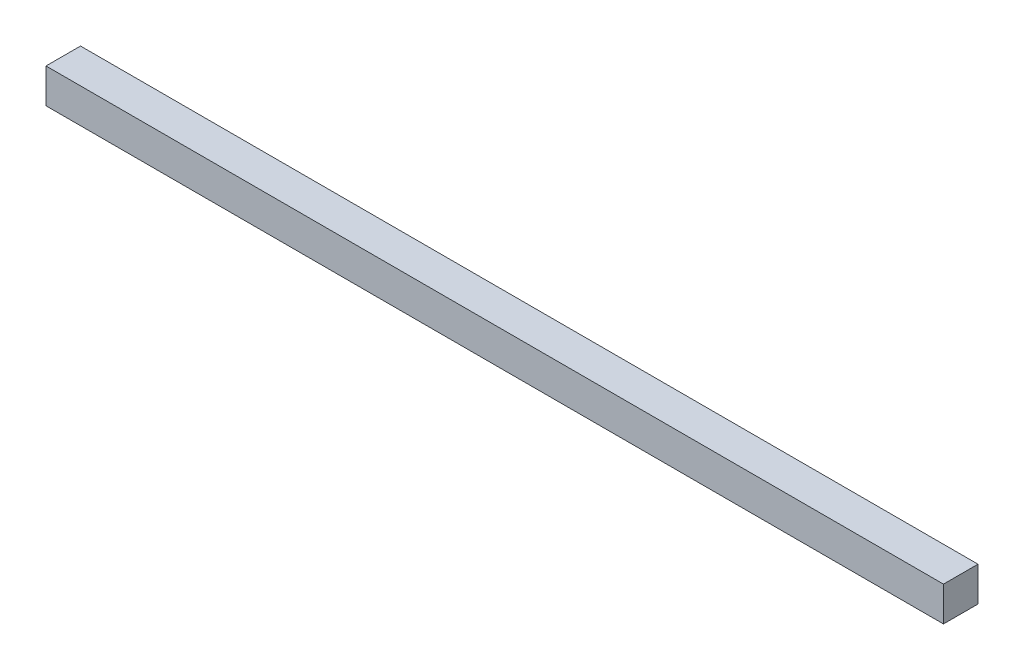
ISO-10303-21;
HEADER;
FILE_DESCRIPTION(('STEP AP214'),'2;1');
FILE_NAME('part.step','',(''),(''),'','','');
FILE_SCHEMA(('AUTOMOTIVE_DESIGN { 1 0 10303 214 1 1 1 1 }'));
ENDSEC;
DATA;
#1=APPLICATION_CONTEXT('core data for automotive mechanical design processes');
#2=APPLICATION_PROTOCOL_DEFINITION('international standard','automotive_design',2000,#1);
#3=PRODUCT_CONTEXT('',#1,'mechanical');
#4=PRODUCT('Part','Part','',(#3));
#5=PRODUCT_RELATED_PRODUCT_CATEGORY('part','',(#4));
#6=PRODUCT_DEFINITION_FORMATION('','',#4);
#7=PRODUCT_DEFINITION_CONTEXT('part definition',#1,'design');
#8=PRODUCT_DEFINITION('design','',#6,#7);
#9=PRODUCT_DEFINITION_SHAPE('','',#8);
#10=(LENGTH_UNIT() NAMED_UNIT(*) SI_UNIT(.MILLI.,.METRE.));
#11=(NAMED_UNIT(*) PLANE_ANGLE_UNIT() SI_UNIT($,.RADIAN.));
#12=(NAMED_UNIT(*) SI_UNIT($,.STERADIAN.) SOLID_ANGLE_UNIT());
#13=UNCERTAINTY_MEASURE_WITH_UNIT(LENGTH_MEASURE(1.E-05),#10,'distance_accuracy_value','');
#14=(GEOMETRIC_REPRESENTATION_CONTEXT(3) GLOBAL_UNCERTAINTY_ASSIGNED_CONTEXT((#13)) GLOBAL_UNIT_ASSIGNED_CONTEXT((#10,
#11,#12)) REPRESENTATION_CONTEXT('',''));
#15=CARTESIAN_POINT('',(0.,0.,0.));
#16=DIRECTION('',(0.,0.,1.));
#17=DIRECTION('',(1.,0.,0.));
#18=AXIS2_PLACEMENT_3D('',#15,#16,#17);
#19=CARTESIAN_POINT('',(0.,38.1,0.));
#20=DIRECTION('',(1.,0.,0.));
#21=DIRECTION('',(0.,0.,-1.));
#22=AXIS2_PLACEMENT_3D('',#19,#20,#21);
#23=PLANE('',#22);
#24=DIRECTION('',(0.,0.,1.));
#25=VECTOR('',#24,1.);
#26=CARTESIAN_POINT('',(0.,0.,0.));
#27=LINE('',#26,#25);
#28=CARTESIAN_POINT('',(0.,0.,-38.1));
#29=VERTEX_POINT('',#28);
#30=CARTESIAN_POINT('',(0.,0.,0.));
#31=VERTEX_POINT('',#30);
#32=EDGE_CURVE('E95',#29,#31,#27,.T.);
#33=ORIENTED_EDGE('',*,*,#32,.T.);
#34=DIRECTION('',(0.,-1.,0.));
#35=VECTOR('',#34,1.);
#36=CARTESIAN_POINT('',(0.,38.1,0.));
#37=LINE('',#36,#35);
#38=CARTESIAN_POINT('',(0.,38.1,0.));
#39=VERTEX_POINT('',#38);
#40=EDGE_CURVE('E11',#39,#31,#37,.T.);
#41=ORIENTED_EDGE('',*,*,#40,.F.);
#42=DIRECTION('',(0.,0.,1.));
#43=VECTOR('',#42,1.);
#44=CARTESIAN_POINT('',(0.,38.1,0.));
#45=LINE('',#44,#43);
#46=CARTESIAN_POINT('',(0.,38.1,-38.1));
#47=VERTEX_POINT('',#46);
#48=EDGE_CURVE('E83',#47,#39,#45,.T.);
#49=ORIENTED_EDGE('',*,*,#48,.F.);
#50=DIRECTION('',(0.,-1.,0.));
#51=VECTOR('',#50,1.);
#52=CARTESIAN_POINT('',(0.,38.1,-38.1));
#53=LINE('',#52,#51);
#54=EDGE_CURVE('E91',#47,#29,#53,.T.);
#55=ORIENTED_EDGE('',*,*,#54,.T.);
#56=EDGE_LOOP('',(#33,#41,#49,#55));
#57=FACE_BOUND('',#56,.T.);
#58=ADVANCED_FACE('F32',(#57),#23,.F.);
#59=CARTESIAN_POINT('',(0.,38.1,0.));
#60=DIRECTION('',(0.,0.,-1.));
#61=DIRECTION('',(-1.,0.,0.));
#62=AXIS2_PLACEMENT_3D('',#59,#60,#61);
#63=PLANE('',#62);
#64=DIRECTION('',(1.,0.,0.));
#65=VECTOR('',#64,1.);
#66=CARTESIAN_POINT('',(0.,0.,0.));
#67=LINE('',#66,#65);
#68=CARTESIAN_POINT('',(990.6,0.,0.));
#69=VERTEX_POINT('',#68);
#70=EDGE_CURVE('E87',#31,#69,#67,.T.);
#71=ORIENTED_EDGE('',*,*,#70,.T.);
#72=DIRECTION('',(0.,-1.,0.));
#73=VECTOR('',#72,1.);
#74=CARTESIAN_POINT('',(990.6,38.1,0.));
#75=LINE('',#74,#73);
#76=CARTESIAN_POINT('',(990.6,38.1,0.));
#77=VERTEX_POINT('',#76);
#78=EDGE_CURVE('E40',#77,#69,#75,.T.);
#79=ORIENTED_EDGE('',*,*,#78,.F.);
#80=DIRECTION('',(1.,0.,0.));
#81=VECTOR('',#80,1.);
#82=CARTESIAN_POINT('',(0.,38.1,0.));
#83=LINE('',#82,#81);
#84=EDGE_CURVE('E78',#39,#77,#83,.T.);
#85=ORIENTED_EDGE('',*,*,#84,.F.);
#86=ORIENTED_EDGE('',*,*,#40,.T.);
#87=EDGE_LOOP('',(#71,#79,#85,#86));
#88=FACE_BOUND('',#87,.T.);
#89=ADVANCED_FACE('F86',(#88),#63,.F.);
#90=CARTESIAN_POINT('',(990.6,38.1,0.));
#91=DIRECTION('',(-1.,0.,0.));
#92=DIRECTION('',(0.,0.,1.));
#93=AXIS2_PLACEMENT_3D('',#90,#91,#92);
#94=PLANE('',#93);
#95=DIRECTION('',(0.,0.,-1.));
#96=VECTOR('',#95,1.);
#97=CARTESIAN_POINT('',(990.6,0.,0.));
#98=LINE('',#97,#96);
#99=CARTESIAN_POINT('',(990.6,0.,-38.1));
#100=VERTEX_POINT('',#99);
#101=EDGE_CURVE('E65',#69,#100,#98,.T.);
#102=ORIENTED_EDGE('',*,*,#101,.T.);
#103=DIRECTION('',(0.,-1.,0.));
#104=VECTOR('',#103,1.);
#105=CARTESIAN_POINT('',(990.6,38.1,-38.1));
#106=LINE('',#105,#104);
#107=CARTESIAN_POINT('',(990.6,38.1,-38.1));
#108=VERTEX_POINT('',#107);
#109=EDGE_CURVE('E88',#108,#100,#106,.T.);
#110=ORIENTED_EDGE('',*,*,#109,.F.);
#111=DIRECTION('',(0.,0.,-1.));
#112=VECTOR('',#111,1.);
#113=CARTESIAN_POINT('',(990.6,38.1,0.));
#114=LINE('',#113,#112);
#115=EDGE_CURVE('E81',#77,#108,#114,.T.);
#116=ORIENTED_EDGE('',*,*,#115,.F.);
#117=ORIENTED_EDGE('',*,*,#78,.T.);
#118=EDGE_LOOP('',(#102,#110,#116,#117));
#119=FACE_BOUND('',#118,.T.);
#120=ADVANCED_FACE('F89',(#119),#94,.F.);
#121=CARTESIAN_POINT('',(0.,38.1,-38.1));
#122=DIRECTION('',(0.,0.,1.));
#123=DIRECTION('',(1.,0.,0.));
#124=AXIS2_PLACEMENT_3D('',#121,#122,#123);
#125=PLANE('',#124);
#126=DIRECTION('',(-1.,0.,0.));
#127=VECTOR('',#126,1.);
#128=CARTESIAN_POINT('',(0.,0.,-38.1));
#129=LINE('',#128,#127);
#130=EDGE_CURVE('E71',#100,#29,#129,.T.);
#131=ORIENTED_EDGE('',*,*,#130,.T.);
#132=ORIENTED_EDGE('',*,*,#54,.F.);
#133=DIRECTION('',(-1.,0.,0.));
#134=VECTOR('',#133,1.);
#135=CARTESIAN_POINT('',(0.,38.1,-38.1));
#136=LINE('',#135,#134);
#137=EDGE_CURVE('E48',#108,#47,#136,.T.);
#138=ORIENTED_EDGE('',*,*,#137,.F.);
#139=ORIENTED_EDGE('',*,*,#109,.T.);
#140=EDGE_LOOP('',(#131,#132,#138,#139));
#141=FACE_BOUND('',#140,.T.);
#142=ADVANCED_FACE('F102',(#141),#125,.F.);
#143=CARTESIAN_POINT('',(0.,38.1,-38.1));
#144=DIRECTION('',(0.,-1.,0.));
#145=DIRECTION('',(0.,0.,-1.));
#146=AXIS2_PLACEMENT_3D('',#143,#144,#145);
#147=PLANE('',#146);
#148=ORIENTED_EDGE('',*,*,#48,.T.);
#149=ORIENTED_EDGE('',*,*,#84,.T.);
#150=ORIENTED_EDGE('',*,*,#115,.T.);
#151=ORIENTED_EDGE('',*,*,#137,.T.);
#152=EDGE_LOOP('',(#148,#149,#150,#151));
#153=FACE_BOUND('',#152,.T.);
#154=ADVANCED_FACE('F79',(#153),#147,.F.);
#155=CARTESIAN_POINT('',(0.,0.,-38.1));
#156=DIRECTION('',(0.,-1.,0.));
#157=DIRECTION('',(0.,0.,-1.));
#158=AXIS2_PLACEMENT_3D('',#155,#156,#157);
#159=PLANE('',#158);
#160=ORIENTED_EDGE('',*,*,#32,.F.);
#161=ORIENTED_EDGE('',*,*,#130,.F.);
#162=ORIENTED_EDGE('',*,*,#101,.F.);
#163=ORIENTED_EDGE('',*,*,#70,.F.);
#164=EDGE_LOOP('',(#160,#161,#162,#163));
#165=FACE_BOUND('',#164,.T.);
#166=ADVANCED_FACE('F105',(#165),#159,.T.);
#167=CLOSED_SHELL('',(#58,#89,#120,#142,#154,#166));
#168=MANIFOLD_SOLID_BREP('B2',#167);
#169=ADVANCED_BREP_SHAPE_REPRESENTATION('',(#18,#168),#14);
#170=SHAPE_DEFINITION_REPRESENTATION(#9,#169);
ENDSEC;
END-ISO-10303-21;
